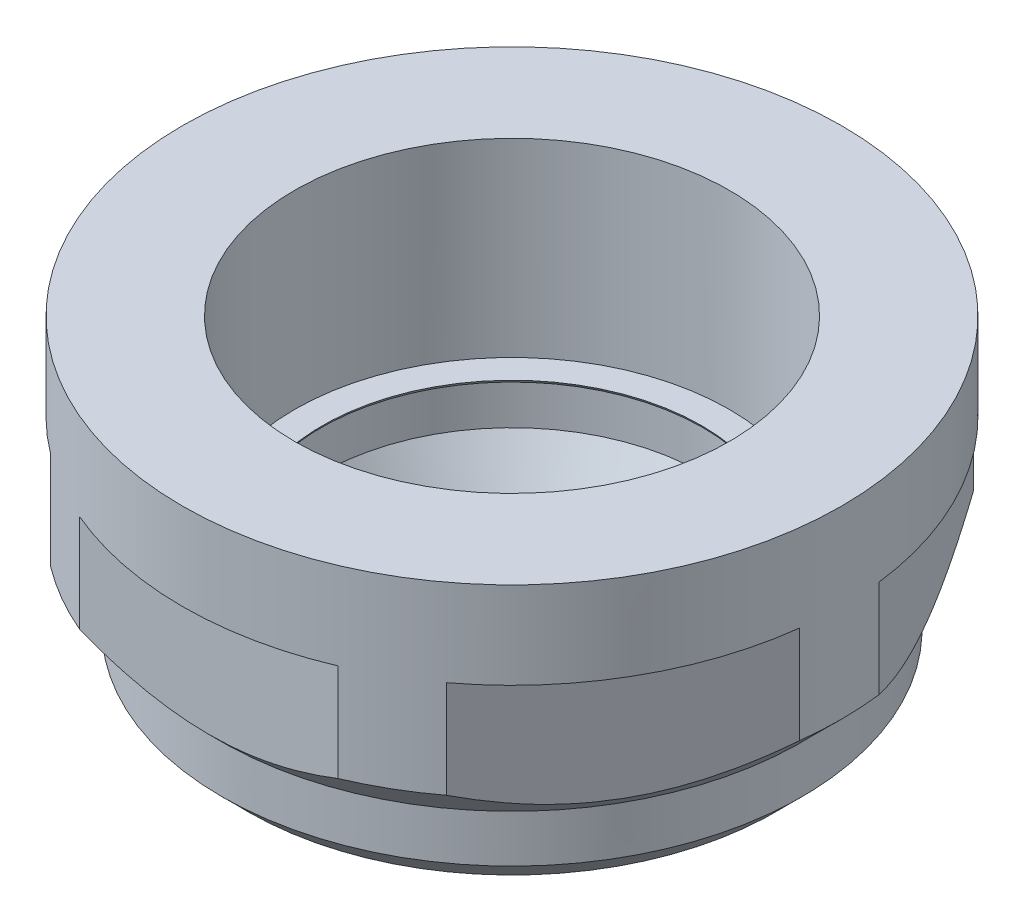
ISO-10303-21;
HEADER;
FILE_DESCRIPTION(('STEP AP214'),'2;1');
FILE_NAME('part.step','',(''),(''),'','','');
FILE_SCHEMA(('AUTOMOTIVE_DESIGN { 1 0 10303 214 1 1 1 1 }'));
ENDSEC;
DATA;
#1=APPLICATION_CONTEXT('core data for automotive mechanical design processes');
#2=APPLICATION_PROTOCOL_DEFINITION('international standard','automotive_design',2000,#1);
#3=PRODUCT_CONTEXT('',#1,'mechanical');
#4=PRODUCT('Part','Part','',(#3));
#5=PRODUCT_RELATED_PRODUCT_CATEGORY('part','',(#4));
#6=PRODUCT_DEFINITION_FORMATION('','',#4);
#7=PRODUCT_DEFINITION_CONTEXT('part definition',#1,'design');
#8=PRODUCT_DEFINITION('design','',#6,#7);
#9=PRODUCT_DEFINITION_SHAPE('','',#8);
#10=(LENGTH_UNIT() NAMED_UNIT(*) SI_UNIT(.MILLI.,.METRE.));
#11=(NAMED_UNIT(*) PLANE_ANGLE_UNIT() SI_UNIT($,.RADIAN.));
#12=(NAMED_UNIT(*) SI_UNIT($,.STERADIAN.) SOLID_ANGLE_UNIT());
#13=UNCERTAINTY_MEASURE_WITH_UNIT(LENGTH_MEASURE(1.E-05),#10,'distance_accuracy_value','');
#14=(GEOMETRIC_REPRESENTATION_CONTEXT(3) GLOBAL_UNCERTAINTY_ASSIGNED_CONTEXT((#13)) GLOBAL_UNIT_ASSIGNED_CONTEXT((#10,
#11,#12)) REPRESENTATION_CONTEXT('',''));
#15=CARTESIAN_POINT('',(0.,0.,0.));
#16=DIRECTION('',(0.,0.,1.));
#17=DIRECTION('',(1.,0.,0.));
#18=AXIS2_PLACEMENT_3D('',#15,#16,#17);
#19=CARTESIAN_POINT('',(0.,0.,0.));
#20=DIRECTION('',(0.,-1.,0.));
#21=DIRECTION('',(0.,0.,-1.));
#22=AXIS2_PLACEMENT_3D('',#19,#20,#21);
#23=CYLINDRICAL_SURFACE('',#22,12.5);
#24=CARTESIAN_POINT('',(0.,11.3,0.));
#25=DIRECTION('',(0.,-1.,0.));
#26=DIRECTION('',(0.,0.,-1.));
#27=AXIS2_PLACEMENT_3D('',#24,#25,#26);
#28=CIRCLE('',#27,12.5);
#29=CARTESIAN_POINT('',(0.,11.3,-12.5));
#30=VERTEX_POINT('',#29);
#31=EDGE_CURVE('E244',#30,#30,#28,.T.);
#32=ORIENTED_EDGE('',*,*,#31,.T.);
#33=EDGE_LOOP('',(#32));
#34=FACE_BOUND('',#33,.T.);
#35=CARTESIAN_POINT('',(0.,8.,0.));
#36=DIRECTION('',(0.,-1.,0.));
#37=DIRECTION('',(0.,0.,-1.));
#38=AXIS2_PLACEMENT_3D('',#35,#36,#37);
#39=CIRCLE('',#38,12.5);
#40=CARTESIAN_POINT('',(-7.50980240073789,8.,9.99264068711927));
#41=VERTEX_POINT('',#40);
#42=CARTESIAN_POINT('',(-12.4087818863042,8.,1.50735931288068));
#43=VERTEX_POINT('',#42);
#44=EDGE_CURVE('E11',#41,#43,#39,.T.);
#45=ORIENTED_EDGE('',*,*,#44,.F.);
#46=DIRECTION('',(0.,-1.,0.));
#47=VECTOR('',#46,1.);
#48=CARTESIAN_POINT('',(-7.50980240073789,0.,9.99264068711927));
#49=LINE('',#48,#47);
#50=CARTESIAN_POINT('',(-7.50980240073789,4.3,9.99264068711927));
#51=VERTEX_POINT('',#50);
#52=EDGE_CURVE('E189',#41,#51,#49,.T.);
#53=ORIENTED_EDGE('',*,*,#52,.T.);
#54=CARTESIAN_POINT('',(0.,4.3,0.));
#55=DIRECTION('',(0.,-1.,0.));
#56=DIRECTION('',(0.,0.,-1.));
#57=AXIS2_PLACEMENT_3D('',#54,#55,#56);
#58=CIRCLE('',#57,12.5);
#59=CARTESIAN_POINT('',(-4.89897948556636,4.3,11.5));
#60=VERTEX_POINT('',#59);
#61=EDGE_CURVE('E240',#60,#51,#58,.T.);
#62=ORIENTED_EDGE('',*,*,#61,.F.);
#63=DIRECTION('',(0.,-1.,0.));
#64=VECTOR('',#63,1.);
#65=CARTESIAN_POINT('',(-4.89897948556636,0.,11.5));
#66=LINE('',#65,#64);
#67=CARTESIAN_POINT('',(-4.89897948556636,8.,11.5));
#68=VERTEX_POINT('',#67);
#69=EDGE_CURVE('E197',#60,#68,#66,.F.);
#70=ORIENTED_EDGE('',*,*,#69,.T.);
#71=CARTESIAN_POINT('',(0.,8.,0.));
#72=DIRECTION('',(0.,-1.,0.));
#73=DIRECTION('',(0.,0.,-1.));
#74=AXIS2_PLACEMENT_3D('',#71,#72,#73);
#75=CIRCLE('',#74,12.5);
#76=CARTESIAN_POINT('',(4.89897948556636,8.,11.5));
#77=VERTEX_POINT('',#76);
#78=EDGE_CURVE('E259',#77,#68,#75,.T.);
#79=ORIENTED_EDGE('',*,*,#78,.F.);
#80=DIRECTION('',(0.,-1.,0.));
#81=VECTOR('',#80,1.);
#82=CARTESIAN_POINT('',(4.89897948556636,0.,11.5));
#83=LINE('',#82,#81);
#84=CARTESIAN_POINT('',(4.89897948556664,4.29999999999991,11.5));
#85=VERTEX_POINT('',#84);
#86=EDGE_CURVE('E201',#77,#85,#83,.T.);
#87=ORIENTED_EDGE('',*,*,#86,.T.);
#88=CARTESIAN_POINT('',(7.50980240073775,4.3,9.99264068711937));
#89=VERTEX_POINT('',#88);
#90=EDGE_CURVE('E150',#89,#85,#58,.T.);
#91=ORIENTED_EDGE('',*,*,#90,.F.);
#92=DIRECTION('',(0.,-1.,0.));
#93=VECTOR('',#92,1.);
#94=CARTESIAN_POINT('',(7.50980240073775,0.,9.99264068711937));
#95=LINE('',#94,#93);
#96=CARTESIAN_POINT('',(7.50980240073775,8.,9.99264068711937));
#97=VERTEX_POINT('',#96);
#98=EDGE_CURVE('E61',#89,#97,#95,.F.);
#99=ORIENTED_EDGE('',*,*,#98,.T.);
#100=CARTESIAN_POINT('',(12.4087818863042,8.,1.50735931288086));
#101=VERTEX_POINT('',#100);
#102=EDGE_CURVE('E48',#101,#97,#39,.T.);
#103=ORIENTED_EDGE('',*,*,#102,.F.);
#104=DIRECTION('',(0.,-1.,0.));
#105=VECTOR('',#104,1.);
#106=CARTESIAN_POINT('',(12.4087818863042,0.,1.50735931288086));
#107=LINE('',#106,#105);
#108=CARTESIAN_POINT('',(12.4087818863042,4.3,1.50735931288086));
#109=VERTEX_POINT('',#108);
#110=EDGE_CURVE('E144',#101,#109,#107,.T.);
#111=ORIENTED_EDGE('',*,*,#110,.T.);
#112=CARTESIAN_POINT('',(12.4087818863042,4.3,-1.5073593128806));
#113=VERTEX_POINT('',#112);
#114=EDGE_CURVE('E575',#113,#109,#58,.T.);
#115=ORIENTED_EDGE('',*,*,#114,.F.);
#116=DIRECTION('',(0.,-1.,0.));
#117=VECTOR('',#116,1.);
#118=CARTESIAN_POINT('',(12.4087818863042,0.,-1.5073593128806));
#119=LINE('',#118,#117);
#120=CARTESIAN_POINT('',(12.4087818863042,8.,-1.5073593128806));
#121=VERTEX_POINT('',#120);
#122=EDGE_CURVE('E69',#113,#121,#119,.F.);
#123=ORIENTED_EDGE('',*,*,#122,.T.);
#124=CARTESIAN_POINT('',(7.50980240073796,8.,-9.99264068711922));
#125=VERTEX_POINT('',#124);
#126=EDGE_CURVE('E141',#125,#121,#39,.T.);
#127=ORIENTED_EDGE('',*,*,#126,.F.);
#128=DIRECTION('',(0.,-1.,0.));
#129=VECTOR('',#128,1.);
#130=CARTESIAN_POINT('',(7.50980240073796,0.,-9.99264068711922));
#131=LINE('',#130,#129);
#132=CARTESIAN_POINT('',(7.50980240073796,4.3,-9.99264068711922));
#133=VERTEX_POINT('',#132);
#134=EDGE_CURVE('E165',#125,#133,#131,.T.);
#135=ORIENTED_EDGE('',*,*,#134,.T.);
#136=CARTESIAN_POINT('',(4.89897948556636,4.3,-11.5));
#137=VERTEX_POINT('',#136);
#138=EDGE_CURVE('E571',#137,#133,#58,.T.);
#139=ORIENTED_EDGE('',*,*,#138,.F.);
#140=DIRECTION('',(0.,-1.,0.));
#141=VECTOR('',#140,1.);
#142=CARTESIAN_POINT('',(4.89897948556636,0.,-11.5));
#143=LINE('',#142,#141);
#144=CARTESIAN_POINT('',(4.89897948556636,8.,-11.5));
#145=VERTEX_POINT('',#144);
#146=EDGE_CURVE('E169',#137,#145,#143,.F.);
#147=ORIENTED_EDGE('',*,*,#146,.T.);
#148=CARTESIAN_POINT('',(-4.89897948556636,8.,-11.5));
#149=VERTEX_POINT('',#148);
#150=EDGE_CURVE('E561',#149,#145,#39,.T.);
#151=ORIENTED_EDGE('',*,*,#150,.F.);
#152=DIRECTION('',(0.,-1.,0.));
#153=VECTOR('',#152,1.);
#154=CARTESIAN_POINT('',(-4.89897948556636,0.,-11.5));
#155=LINE('',#154,#153);
#156=CARTESIAN_POINT('',(-4.89897948556636,4.3,-11.5));
#157=VERTEX_POINT('',#156);
#158=EDGE_CURVE('E173',#149,#157,#155,.T.);
#159=ORIENTED_EDGE('',*,*,#158,.T.);
#160=CARTESIAN_POINT('',(-7.50980240073782,4.3,-9.99264068711932));
#161=VERTEX_POINT('',#160);
#162=EDGE_CURVE('E574',#161,#157,#58,.T.);
#163=ORIENTED_EDGE('',*,*,#162,.F.);
#164=DIRECTION('',(0.,-1.,0.));
#165=VECTOR('',#164,1.);
#166=CARTESIAN_POINT('',(-7.50980240073782,0.,-9.99264068711932));
#167=LINE('',#166,#165);
#168=CARTESIAN_POINT('',(-7.50980240073782,8.,-9.99264068711932));
#169=VERTEX_POINT('',#168);
#170=EDGE_CURVE('E177',#161,#169,#167,.F.);
#171=ORIENTED_EDGE('',*,*,#170,.T.);
#172=CARTESIAN_POINT('',(-12.4087818863042,8.,-1.50735931288077));
#173=VERTEX_POINT('',#172);
#174=EDGE_CURVE('E54',#173,#169,#39,.T.);
#175=ORIENTED_EDGE('',*,*,#174,.F.);
#176=DIRECTION('',(0.,-1.,0.));
#177=VECTOR('',#176,1.);
#178=CARTESIAN_POINT('',(-12.4087818863042,0.,-1.50735931288077));
#179=LINE('',#178,#177);
#180=CARTESIAN_POINT('',(-12.4087818863042,4.3,-1.50735931288077));
#181=VERTEX_POINT('',#180);
#182=EDGE_CURVE('E181',#173,#181,#179,.T.);
#183=ORIENTED_EDGE('',*,*,#182,.T.);
#184=CARTESIAN_POINT('',(-12.4087818863042,4.3,1.50735931288069));
#185=VERTEX_POINT('',#184);
#186=EDGE_CURVE('E245',#185,#181,#58,.T.);
#187=ORIENTED_EDGE('',*,*,#186,.F.);
#188=DIRECTION('',(0.,-1.,0.));
#189=VECTOR('',#188,1.);
#190=CARTESIAN_POINT('',(-12.4087818863042,0.,1.50735931288069));
#191=LINE('',#190,#189);
#192=EDGE_CURVE('E185',#185,#43,#191,.F.);
#193=ORIENTED_EDGE('',*,*,#192,.T.);
#194=EDGE_LOOP('',(#45,#53,#62,#70,#79,#87,#91,#99,#103,#111,#115,#123,#127,#135,#139,#147,#151,
#159,#163,#171,#175,#183,#187,#193));
#195=FACE_BOUND('',#194,.T.);
#196=ADVANCED_FACE('F44',(#34,#195),#23,.T.);
#197=CARTESIAN_POINT('',(-10.,0.,0.));
#198=DIRECTION('',(0.,1.,0.));
#199=DIRECTION('',(0.,0.,1.));
#200=AXIS2_PLACEMENT_3D('',#197,#198,#199);
#201=PLANE('',#200);
#202=CARTESIAN_POINT('',(0.,0.,0.));
#203=DIRECTION('',(0.,-1.,0.));
#204=DIRECTION('',(0.,0.,-1.));
#205=AXIS2_PLACEMENT_3D('',#202,#203,#204);
#206=CIRCLE('',#205,10.);
#207=CARTESIAN_POINT('',(0.,0.,-10.));
#208=VERTEX_POINT('',#207);
#209=EDGE_CURVE('E228',#208,#208,#206,.T.);
#210=ORIENTED_EDGE('',*,*,#209,.T.);
#211=EDGE_LOOP('',(#210));
#212=FACE_BOUND('',#211,.T.);
#213=CARTESIAN_POINT('',(0.,0.,0.));
#214=DIRECTION('',(0.,-1.,0.));
#215=DIRECTION('',(0.,0.,-1.));
#216=AXIS2_PLACEMENT_3D('',#213,#214,#215);
#217=CIRCLE('',#216,5.80662432702593);
#218=CARTESIAN_POINT('',(0.,0.,-5.80662432702593));
#219=VERTEX_POINT('',#218);
#220=EDGE_CURVE('E224',#219,#219,#217,.T.);
#221=ORIENTED_EDGE('',*,*,#220,.F.);
#222=EDGE_LOOP('',(#221));
#223=FACE_BOUND('',#222,.T.);
#224=ADVANCED_FACE('F341',(#212,#223),#201,.F.);
#225=CARTESIAN_POINT('',(-12.5,11.3,0.));
#226=DIRECTION('',(0.,-1.,0.));
#227=DIRECTION('',(0.,0.,-1.));
#228=AXIS2_PLACEMENT_3D('',#225,#226,#227);
#229=PLANE('',#228);
#230=CARTESIAN_POINT('',(0.,11.3,0.));
#231=DIRECTION('',(0.,1.,0.));
#232=DIRECTION('',(0.,0.,1.));
#233=AXIS2_PLACEMENT_3D('',#230,#231,#232);
#234=CIRCLE('',#233,8.25);
#235=CARTESIAN_POINT('',(0.,11.3,8.25));
#236=VERTEX_POINT('',#235);
#237=EDGE_CURVE('E204',#236,#236,#234,.T.);
#238=ORIENTED_EDGE('',*,*,#237,.F.);
#239=EDGE_LOOP('',(#238));
#240=FACE_BOUND('',#239,.T.);
#241=ORIENTED_EDGE('',*,*,#31,.F.);
#242=EDGE_LOOP('',(#241));
#243=FACE_BOUND('',#242,.T.);
#244=ADVANCED_FACE('F46',(#240,#243),#229,.F.);
#245=CARTESIAN_POINT('',(0.,4.3,0.));
#246=DIRECTION('',(0.,1.,0.));
#247=DIRECTION('',(0.,0.,1.));
#248=AXIS2_PLACEMENT_3D('',#245,#246,#247);
#249=CONICAL_SURFACE('',#248,12.5,0.785398163397447);
#250=CARTESIAN_POINT('',(0.,2.79999999999999,0.));
#251=DIRECTION('',(0.,-1.,0.));
#252=DIRECTION('',(0.,0.,-1.));
#253=AXIS2_PLACEMENT_3D('',#250,#251,#252);
#254=CIRCLE('',#253,11.);
#255=CARTESIAN_POINT('',(0.,2.79999999999999,-11.));
#256=VERTEX_POINT('',#255);
#257=EDGE_CURVE('E236',#256,#256,#254,.T.);
#258=ORIENTED_EDGE('',*,*,#257,.F.);
#259=EDGE_LOOP('',(#258));
#260=FACE_BOUND('',#259,.T.);
#261=ORIENTED_EDGE('',*,*,#61,.T.);
#262=CARTESIAN_POINT('',(-7.50954725680327,4.3002,9.99308260937728));
#263=CARTESIAN_POINT('',(-7.60320388466721,4.22678602630348,9.83086457145136));
#264=CARTESIAN_POINT('',(-7.69746398783073,4.15645504779764,9.66760128364545));
#265=CARTESIAN_POINT('',(-7.88722179118836,4.02261542047035,9.33893112709737));
#266=CARTESIAN_POINT('',(-7.98271990557269,3.95910912457528,9.17352354095669));
#267=CARTESIAN_POINT('',(-8.27145088309206,3.77961750230972,8.67342681817411));
#268=CARTESIAN_POINT('',(-8.46650035350401,3.67499486488197,8.33559122543122));
#269=CARTESIAN_POINT('',(-8.85898212114275,3.50246664844852,7.65579286283646));
#270=CARTESIAN_POINT('',(-9.05638036657891,3.43425834287242,7.31388907241607));
#271=CARTESIAN_POINT('',(-9.35415117795865,3.36182614192228,6.79813489809537));
#272=CARTESIAN_POINT('',(-9.45365130618154,3.3426636284266,6.62579562065369));
#273=CARTESIAN_POINT('',(-9.65300814090227,3.31458876137679,6.28049945408129));
#274=CARTESIAN_POINT('',(-9.75286479701911,3.30567501292755,6.10754265221297));
#275=CARTESIAN_POINT('',(-9.94878007774333,3.29841574605801,5.7682074320195));
#276=CARTESIAN_POINT('',(-10.0448351190914,3.29967205911473,5.60183522008153));
#277=CARTESIAN_POINT('',(-10.2367882842751,3.31178573042226,5.26936258530977));
#278=CARTESIAN_POINT('',(-10.3326864162155,3.32264257601293,5.10326214843791));
#279=CARTESIAN_POINT('',(-10.5241386103169,3.35377791625605,4.77165722103387));
#280=CARTESIAN_POINT('',(-10.6196925143207,3.37406029350188,4.60615300443768));
#281=CARTESIAN_POINT('',(-10.8102130868605,3.42370616038155,4.27616169291167));
#282=CARTESIAN_POINT('',(-10.9051796794171,3.45307080090065,4.11167472958195));
#283=CARTESIAN_POINT('',(-11.1886609726452,3.55403745888742,3.62067072671556));
#284=CARTESIAN_POINT('',(-11.3760495375729,3.63856211352554,3.29610421150338));
#285=CARTESIAN_POINT('',(-11.7467600464601,3.83753972384318,2.65401477521092));
#286=CARTESIAN_POINT('',(-11.9300815222568,3.951996105773,2.33649266501248));
#287=CARTESIAN_POINT('',(-12.1611756655044,4.11399139107226,1.93622586757615));
#288=CARTESIAN_POINT('',(-12.2110268906147,4.15000907902424,1.84988101286555));
#289=CARTESIAN_POINT('',(-12.3103188049221,4.22380068400442,1.67790237250439));
#290=CARTESIAN_POINT('',(-12.3597599957871,4.26157189970384,1.59226771793941));
#291=CARTESIAN_POINT('',(-12.4090370302388,4.3002,1.50691739062268));
#292=B_SPLINE_CURVE_WITH_KNOTS('',3,(#262,#263,#264,#265,#266,#267,#268,#269,#270,#271,#272,
#273,#274,#275,#276,#277,#278,#279,#280,#281,#282,#283,#284,#285,#286,#287,#288,#289,#290,#291),
.UNSPECIFIED.,.F.,.F.,(4,2,2,2,2,2,2,2,2,2,2,2,2,2,4),(0.,0.603515867391192,1.20723914416742,
2.41739229578831,3.61732180894164,4.21685988655414,4.81631635513753,5.39242041024152,
5.96849370374486,6.54480450572042,7.12118836652659,8.27220258349449,9.42334861344793,
9.74136578117776,10.0589083210021),.UNSPECIFIED.);
#293=EDGE_CURVE('E142',#51,#185,#292,.T.);
#294=ORIENTED_EDGE('',*,*,#293,.T.);
#295=ORIENTED_EDGE('',*,*,#186,.T.);
#296=CARTESIAN_POINT('',(-12.4090370302388,4.3002,-1.50691739062277));
#297=CARTESIAN_POINT('',(-12.3153804023749,4.22678602630348,-1.66913542854868));
#298=CARTESIAN_POINT('',(-12.2211202992114,4.15645504779764,-1.83239871635459));
#299=CARTESIAN_POINT('',(-12.0313624958537,4.02261542047035,-2.16106887290267));
#300=CARTESIAN_POINT('',(-11.9358643814694,3.95910912457528,-2.32647645904334));
#301=CARTESIAN_POINT('',(-11.64713340395,3.77961750230972,-2.82657318182592));
#302=CARTESIAN_POINT('',(-11.4520839335381,3.67499486488197,-3.16440877456882));
#303=CARTESIAN_POINT('',(-11.0596021658993,3.50246664844853,-3.84420713716357));
#304=CARTESIAN_POINT('',(-10.8622039204632,3.43425834287242,-4.18611092758395));
#305=CARTESIAN_POINT('',(-10.5644331090834,3.36182614192228,-4.70186510190466));
#306=CARTESIAN_POINT('',(-10.4649329808605,3.3426636284266,-4.87420437934633));
#307=CARTESIAN_POINT('',(-10.2655761461398,3.31458876137679,-5.21950054591874));
#308=CARTESIAN_POINT('',(-10.165719490023,3.30567501292755,-5.39245734778705));
#309=CARTESIAN_POINT('',(-9.96980420929874,3.29841574605801,-5.73179256798052));
#310=CARTESIAN_POINT('',(-9.87374916795068,3.29967205911473,-5.89816477991849));
#311=CARTESIAN_POINT('',(-9.68179600276703,3.31178573042226,-6.23063741469024));
#312=CARTESIAN_POINT('',(-9.58589787082654,3.32264257601293,-6.39673785156211));
#313=CARTESIAN_POINT('',(-9.39444567672521,3.35377791625605,-6.72834277896614));
#314=CARTESIAN_POINT('',(-9.29889177272138,3.37406029350188,-6.89384699556233));
#315=CARTESIAN_POINT('',(-9.1083712001816,3.42370616038155,-7.22383830708835));
#316=CARTESIAN_POINT('',(-9.013404607625,3.45307080090065,-7.38832527041806));
#317=CARTESIAN_POINT('',(-8.7299233143969,3.55403745888742,-7.87932927328445));
#318=CARTESIAN_POINT('',(-8.54253474946921,3.63856211352554,-8.20389578849663));
#319=CARTESIAN_POINT('',(-8.17182424058194,3.83753972384318,-8.84598522478909));
#320=CARTESIAN_POINT('',(-7.98850276478521,3.951996105773,-9.16350733498753));
#321=CARTESIAN_POINT('',(-7.75740862153768,4.11399139107226,-9.56377413242385));
#322=CARTESIAN_POINT('',(-7.70755739642737,4.15000907902424,-9.65011898713445));
#323=CARTESIAN_POINT('',(-7.60826548211999,4.22380068400442,-9.82209762749561));
#324=CARTESIAN_POINT('',(-7.55882429125494,4.26157189970384,-9.90773228206059));
#325=CARTESIAN_POINT('',(-7.5095472568032,4.3002,-9.99308260937732));
#326=B_SPLINE_CURVE_WITH_KNOTS('',3,(#296,#297,#298,#299,#300,#301,#302,#303,#304,#305,#306,
#307,#308,#309,#310,#311,#312,#313,#314,#315,#316,#317,#318,#319,#320,#321,#322,#323,#324,#325),
.UNSPECIFIED.,.F.,.F.,(4,2,2,2,2,2,2,2,2,2,2,2,2,2,4),(0.,0.603515867391193,1.20723914416742,
2.4173922957883,3.61732180894164,4.21685988655414,4.81631635513753,5.39242041024151,
5.96849370374485,6.54480450572042,7.12118836652658,8.27220258349449,9.42334861344792,
9.74136578117775,10.0589083210021),.UNSPECIFIED.);
#327=EDGE_CURVE('E298',#181,#161,#326,.T.);
#328=ORIENTED_EDGE('',*,*,#327,.T.);
#329=ORIENTED_EDGE('',*,*,#162,.T.);
#330=CARTESIAN_POINT('',(-13.345164717821,9.41656667304314,-11.5));
#331=CARTESIAN_POINT('',(-13.0206857914466,9.17081833500919,-11.5));
#332=CARTESIAN_POINT('',(-12.6944017140547,8.92741491072988,-11.5));
#333=CARTESIAN_POINT('',(-12.0375067482082,8.4463514742273,-11.5));
#334=CARTESIAN_POINT('',(-11.7068948046201,8.20869290437065,-11.5));
#335=CARTESIAN_POINT('',(-11.0382089221408,7.73848227127449,-11.5));
#336=CARTESIAN_POINT('',(-10.7000970231063,7.50598400921161,-11.5));
#337=CARTESIAN_POINT('',(-10.0181522543491,7.0495623938496,-11.5));
#338=CARTESIAN_POINT('',(-9.67431978935343,6.8256384375923,-11.5));
#339=CARTESIAN_POINT('',(-8.95980972067628,6.37555294922629,-11.5));
#340=CARTESIAN_POINT('',(-8.588734361363,6.15001965333814,-11.5));
#341=CARTESIAN_POINT('',(-7.83791120612329,5.71364402612219,-11.5));
#342=CARTESIAN_POINT('',(-7.45816203446283,5.50280404705562,-11.5));
#343=CARTESIAN_POINT('',(-6.69000285141517,5.10035444791485,-11.5));
#344=CARTESIAN_POINT('',(-6.30162269711823,4.90868828553966,-11.5));
#345=CARTESIAN_POINT('',(-5.51420250829026,4.5488778259845,-11.5));
#346=CARTESIAN_POINT('',(-5.1151674351297,4.38072280091793,-11.5));
#347=CARTESIAN_POINT('',(-4.33965651465308,4.08678000547791,-11.5));
#348=CARTESIAN_POINT('',(-3.96408756551915,3.95862426986464,-11.5));
#349=CARTESIAN_POINT('',(-3.20381724269432,3.73242924077372,-11.5));
#350=CARTESIAN_POINT('',(-2.81911525044026,3.63439199346715,-11.5));
#351=CARTESIAN_POINT('',(-2.04932448535138,3.47521566298782,-11.5));
#352=CARTESIAN_POINT('',(-1.66436994690094,3.41343804866037,-11.5));
#353=CARTESIAN_POINT('',(-0.89023170183123,3.32799642541784,-11.5));
#354=CARTESIAN_POINT('',(-0.501048758530793,3.3043256488083,-11.5));
#355=CARTESIAN_POINT('',(0.263130632200306,3.29690034116124,-11.5));
#356=CARTESIAN_POINT('',(0.638113355925546,3.3116862436956,-11.5));
#357=CARTESIAN_POINT('',(1.38491696786417,3.37711302506578,-11.5));
#358=CARTESIAN_POINT('',(1.75673754855237,3.42775735175354,-11.5));
#359=CARTESIAN_POINT('',(2.50081399038522,3.5629822642582,-11.5));
#360=CARTESIAN_POINT('',(2.87296252143321,3.64814397257287,-11.5));
#361=CARTESIAN_POINT('',(3.60913770670876,3.84783107137947,-11.5));
#362=CARTESIAN_POINT('',(3.97316500218602,3.96235413452606,-11.5));
#363=CARTESIAN_POINT('',(4.72373254000522,4.22697597858958,-11.5));
#364=CARTESIAN_POINT('',(5.10947948676676,4.37930171670574,-11.5));
#365=CARTESIAN_POINT('',(5.87097293216513,4.70736803911418,-11.5));
#366=CARTESIAN_POINT('',(6.24671470257629,4.88311946626187,-11.5));
#367=CARTESIAN_POINT('',(6.99002219401752,5.25385855660608,-11.5));
#368=CARTESIAN_POINT('',(7.35755764889467,5.44890641241889,-11.5));
#369=CARTESIAN_POINT('',(8.08417765456329,5.85393079193678,-11.5));
#370=CARTESIAN_POINT('',(8.443263529418,6.06390495564813,-11.5));
#371=CARTESIAN_POINT('',(9.13644642307364,6.4851192401991,-11.5));
#372=CARTESIAN_POINT('',(9.47089854514101,6.69577806002316,-11.5));
#373=CARTESIAN_POINT('',(10.1340600766163,7.12597573671376,-11.5));
#374=CARTESIAN_POINT('',(10.4627690491169,7.34551526500016,-11.5));
#375=CARTESIAN_POINT('',(11.1125344863582,7.79007923784461,-11.5));
#376=CARTESIAN_POINT('',(11.4336313827967,8.01504480011891,-11.5));
#377=CARTESIAN_POINT('',(12.0714336041769,8.47094126788601,-11.5));
#378=CARTESIAN_POINT('',(12.3881401131769,8.70187051494423,-11.5));
#379=CARTESIAN_POINT('',(12.7030075196343,8.93523854645405,-11.5));
#380=B_SPLINE_CURVE_WITH_KNOTS('',3,(#330,#331,#332,#333,#334,#335,#336,#337,#338,#339,#340,
#341,#342,#343,#344,#345,#346,#347,#348,#349,#350,#351,#352,#353,#354,#355,#356,#357,#358,#359,
#360,#361,#362,#363,#364,#365,#366,#367,#368,#369,#370,#371,#372,#373,#374,#375,#376,#377,#378,
#379),.UNSPECIFIED.,.F.,.F.,(4,2,2,2,2,2,2,2,2,2,2,2,2,2,2,2,2,2,2,2,2,2,2,2,4),(0.,
1.22113374842284,2.44257096899193,3.6734675714011,4.90427745573231,6.20671938815133,
7.50936935249995,8.80805704669759,10.1061502157847,11.2956050367545,12.4851406483036,
13.6530460396322,14.8207439905218,15.9447758977162,17.0689158972783,18.2128243965211,
19.3566422511916,20.5998769171324,21.8436890402128,23.0915113360517,24.3391367760541,
25.524770570584,26.7104941722968,27.8866067944889,29.0623958017999),.UNSPECIFIED.);
#381=EDGE_CURVE('E291',#157,#137,#380,.T.);
#382=ORIENTED_EDGE('',*,*,#381,.T.);
#383=ORIENTED_EDGE('',*,*,#138,.T.);
#384=CARTESIAN_POINT('',(7.50954725680334,4.3002,-9.99308260937722));
#385=CARTESIAN_POINT('',(7.60320388466728,4.22678602630348,-9.8308645714513));
#386=CARTESIAN_POINT('',(7.6974639878308,4.15645504779763,-9.66760128364539));
#387=CARTESIAN_POINT('',(7.88722179118843,4.02261542047035,-9.33893112709731));
#388=CARTESIAN_POINT('',(7.98271990557275,3.95910912457527,-9.17352354095664));
#389=CARTESIAN_POINT('',(8.27145088309212,3.77961750230972,-8.67342681817405));
#390=CARTESIAN_POINT('',(8.46650035350407,3.67499486488197,-8.33559122543116));
#391=CARTESIAN_POINT('',(8.85898212114281,3.50246664844852,-7.6557928628364));
#392=CARTESIAN_POINT('',(9.05638036657896,3.43425834287242,-7.31388907241601));
#393=CARTESIAN_POINT('',(9.35415117795869,3.36182614192227,-6.7981348980953));
#394=CARTESIAN_POINT('',(9.45365130618159,3.3426636284266,-6.62579562065362));
#395=CARTESIAN_POINT('',(9.65300814090231,3.31458876137679,-6.28049945408122));
#396=CARTESIAN_POINT('',(9.75286479701916,3.30567501292755,-6.1075426522129));
#397=CARTESIAN_POINT('',(9.94878007774338,3.29841574605801,-5.76820743201943));
#398=CARTESIAN_POINT('',(10.0448351190914,3.29967205911473,-5.60183522008146));
#399=CARTESIAN_POINT('',(10.2367882842751,3.31178573042226,-5.26936258530971));
#400=CARTESIAN_POINT('',(10.3326864162156,3.32264257601293,-5.10326214843784));
#401=CARTESIAN_POINT('',(10.5241386103169,3.35377791625605,-4.7716572210338));
#402=CARTESIAN_POINT('',(10.6196925143207,3.37406029350188,-4.60615300443761));
#403=CARTESIAN_POINT('',(10.8102130868605,3.42370616038155,-4.27616169291159));
#404=CARTESIAN_POINT('',(10.9051796794171,3.45307080090065,-4.11167472958188));
#405=CARTESIAN_POINT('',(11.1886609726452,3.55403745888742,-3.62067072671548));
#406=CARTESIAN_POINT('',(11.3760495375729,3.63856211352553,-3.2961042115033));
#407=CARTESIAN_POINT('',(11.7467600464601,3.83753972384317,-2.65401477521084));
#408=CARTESIAN_POINT('',(11.9300815222569,3.951996105773,-2.3364926650124));
#409=CARTESIAN_POINT('',(12.1611756655044,4.11399139107226,-1.93622586757607));
#410=CARTESIAN_POINT('',(12.2110268906147,4.15000907902424,-1.84988101286547));
#411=CARTESIAN_POINT('',(12.3103188049221,4.22380068400442,-1.67790237250431));
#412=CARTESIAN_POINT('',(12.3597599957871,4.26157189970384,-1.59226771793933));
#413=CARTESIAN_POINT('',(12.4090370302389,4.3002,-1.50691739062259));
#414=B_SPLINE_CURVE_WITH_KNOTS('',3,(#384,#385,#386,#387,#388,#389,#390,#391,#392,#393,#394,
#395,#396,#397,#398,#399,#400,#401,#402,#403,#404,#405,#406,#407,#408,#409,#410,#411,#412,#413),
.UNSPECIFIED.,.F.,.F.,(4,2,2,2,2,2,2,2,2,2,2,2,2,2,4),(0.,0.603515867391192,1.20723914416742,
2.41739229578831,3.61732180894164,4.21685988655414,4.81631635513753,5.39242041024151,
5.96849370374485,6.54480450572042,7.12118836652658,8.27220258349448,9.42334861344792,
9.74136578117775,10.0589083210021),.UNSPECIFIED.);
#415=EDGE_CURVE('E284',#133,#113,#414,.T.);
#416=ORIENTED_EDGE('',*,*,#415,.T.);
#417=ORIENTED_EDGE('',*,*,#114,.T.);
#418=CARTESIAN_POINT('',(12.4090370302388,4.3002,1.50691739062285));
#419=CARTESIAN_POINT('',(12.3153804023749,4.22678602630348,1.66913542854877));
#420=CARTESIAN_POINT('',(12.2211202992114,4.15645504779763,1.83239871635468));
#421=CARTESIAN_POINT('',(12.0313624958537,4.02261542047035,2.16106887290275));
#422=CARTESIAN_POINT('',(11.9358643814694,3.95910912457528,2.32647645904343));
#423=CARTESIAN_POINT('',(11.64713340395,3.77961750230972,2.82657318182601));
#424=CARTESIAN_POINT('',(11.4520839335381,3.67499486488197,3.1644087745689));
#425=CARTESIAN_POINT('',(11.0596021658993,3.50246664844852,3.84420713716365));
#426=CARTESIAN_POINT('',(10.8622039204631,3.43425834287242,4.18611092758403));
#427=CARTESIAN_POINT('',(10.5644331090834,3.36182614192228,4.70186510190474));
#428=CARTESIAN_POINT('',(10.4649329808605,3.3426636284266,4.87420437934641));
#429=CARTESIAN_POINT('',(10.2655761461398,3.31458876137679,5.21950054591881));
#430=CARTESIAN_POINT('',(10.1657194900229,3.30567501292755,5.39245734778713));
#431=CARTESIAN_POINT('',(9.9698042092987,3.29841574605801,5.73179256798059));
#432=CARTESIAN_POINT('',(9.87374916795064,3.29967205911473,5.89816477991856));
#433=CARTESIAN_POINT('',(9.68179600276698,3.31178573042226,6.23063741469031));
#434=CARTESIAN_POINT('',(9.58589787082649,3.32264257601293,6.39673785156218));
#435=CARTESIAN_POINT('',(9.39444567672516,3.35377791625605,6.72834277896621));
#436=CARTESIAN_POINT('',(9.29889177272133,3.37406029350188,6.8938469955624));
#437=CARTESIAN_POINT('',(9.10837120018155,3.42370616038155,7.22383830708841));
#438=CARTESIAN_POINT('',(9.01340460762495,3.45307080090065,7.38832527041813));
#439=CARTESIAN_POINT('',(8.72992331439685,3.55403745888742,7.87932927328452));
#440=CARTESIAN_POINT('',(8.54253474946915,3.63856211352554,8.20389578849669));
#441=CARTESIAN_POINT('',(8.17182424058188,3.83753972384318,8.84598522478915));
#442=CARTESIAN_POINT('',(7.98850276478515,3.951996105773,9.16350733498758));
#443=CARTESIAN_POINT('',(7.75740862153761,4.11399139107226,9.56377413242391));
#444=CARTESIAN_POINT('',(7.70755739642731,4.15000907902424,9.65011898713451));
#445=CARTESIAN_POINT('',(7.60826548211992,4.22380068400442,9.82209762749566));
#446=CARTESIAN_POINT('',(7.55882429125487,4.26157189970384,9.90773228206064));
#447=CARTESIAN_POINT('',(7.50954725680313,4.3002,9.99308260937738));
#448=B_SPLINE_CURVE_WITH_KNOTS('',3,(#418,#419,#420,#421,#422,#423,#424,#425,#426,#427,#428,
#429,#430,#431,#432,#433,#434,#435,#436,#437,#438,#439,#440,#441,#442,#443,#444,#445,#446,#447),
.UNSPECIFIED.,.F.,.F.,(4,2,2,2,2,2,2,2,2,2,2,2,2,2,4),(0.,0.603515867391192,1.20723914416742,
2.41739229578831,3.61732180894164,4.21685988655414,4.81631635513753,5.39242041024151,
5.96849370374485,6.54480450572041,7.12118836652658,8.27220258349448,9.42334861344792,
9.74136578117774,10.0589083210021),.UNSPECIFIED.);
#449=EDGE_CURVE('E276',#109,#89,#448,.T.);
#450=ORIENTED_EDGE('',*,*,#449,.T.);
#451=ORIENTED_EDGE('',*,*,#90,.T.);
#452=CARTESIAN_POINT('',(-13.8612380538536,9.81066129784247,11.5));
#453=CARTESIAN_POINT('',(-13.5263766438228,9.55300548430736,11.5));
#454=CARTESIAN_POINT('',(-13.1897115166881,9.29765703765776,11.5));
#455=CARTESIAN_POINT('',(-12.5120363828083,8.792629199495,11.5));
#456=CARTESIAN_POINT('',(-12.171025367443,8.54295116283867,11.5));
#457=CARTESIAN_POINT('',(-11.4814290609378,8.04854166196527,11.5));
#458=CARTESIAN_POINT('',(-11.1328056329772,7.80386321666104,11.5));
#459=CARTESIAN_POINT('',(-10.4297576584665,7.32301635753564,11.5));
#460=CARTESIAN_POINT('',(-10.0753335137352,7.08684735785839,11.5));
#461=CARTESIAN_POINT('',(-9.33700033412278,6.6103019768615,11.5));
#462=CARTESIAN_POINT('',(-8.95264752515094,6.37060970512933,11.5));
#463=CARTESIAN_POINT('',(-8.17491564158931,5.90609547542514,11.5));
#464=CARTESIAN_POINT('',(-7.78153506217769,5.68127602118271,11.5));
#465=CARTESIAN_POINT('',(-6.98563885090295,5.2512947407858,11.5));
#466=CARTESIAN_POINT('',(-6.58315463899398,5.04607521103257,11.5));
#467=CARTESIAN_POINT('',(-5.76680521132552,4.65989169749234,11.5));
#468=CARTESIAN_POINT('',(-5.35294547817307,4.47891626762926,11.5));
#469=CARTESIAN_POINT('',(-4.55444586645618,4.16414514676762,11.5));
#470=CARTESIAN_POINT('',(-4.17095882830476,4.02745470116268,11.5));
#471=CARTESIAN_POINT('',(-3.39421030837687,3.78476915281813,11.5));
#472=CARTESIAN_POINT('',(-3.00094820612853,3.67877600401875,11.5));
#473=CARTESIAN_POINT('',(-2.21385012974057,3.50499086598435,11.5));
#474=CARTESIAN_POINT('',(-1.82017004040771,3.43650471794028,11.5));
#475=CARTESIAN_POINT('',(-1.02791316076795,3.33916307885739,11.5));
#476=CARTESIAN_POINT('',(-0.629337405300943,3.31029935313062,11.5));
#477=CARTESIAN_POINT('',(0.151186202461904,3.29466378010845,11.5));
#478=CARTESIAN_POINT('',(0.533098600788022,3.30610560410842,11.5));
#479=CARTESIAN_POINT('',(1.29394541094463,3.36634744718735,11.5));
#480=CARTESIAN_POINT('',(1.67287954929391,3.41515085745393,11.5));
#481=CARTESIAN_POINT('',(2.4314495777494,3.54818510777867,11.5));
#482=CARTESIAN_POINT('',(2.81097386524631,3.63304161386399,11.5));
#483=CARTESIAN_POINT('',(3.56166382931449,3.83347281774734,11.5));
#484=CARTESIAN_POINT('',(3.93282997741709,3.94904577791799,11.5));
#485=CARTESIAN_POINT('',(4.68715186915965,4.21319530053486,11.5));
#486=CARTESIAN_POINT('',(5.06977107722233,4.36328666602302,11.5));
#487=CARTESIAN_POINT('',(5.82516844935641,4.68665846578115,11.5));
#488=CARTESIAN_POINT('',(6.19794208592648,4.85994935351362,11.5));
#489=CARTESIAN_POINT('',(6.93540833780696,5.22561071799191,11.5));
#490=CARTESIAN_POINT('',(7.30007158111164,5.41803995149576,11.5));
#491=CARTESIAN_POINT('',(8.0210422215054,5.81774352106904,11.5));
#492=CARTESIAN_POINT('',(8.37735089368,6.02501557197301,11.5));
#493=CARTESIAN_POINT('',(9.06529074963301,6.44097742831745,11.5));
#494=CARTESIAN_POINT('',(9.39727169767738,6.6490918315058,11.5));
#495=CARTESIAN_POINT('',(10.0555298881723,7.07417972934027,11.5));
#496=CARTESIAN_POINT('',(10.3818067003983,7.29115388813634,11.5));
#497=CARTESIAN_POINT('',(11.0267798174898,7.73061523377701,11.5));
#498=CARTESIAN_POINT('',(11.345515951002,7.95304417647772,11.5));
#499=CARTESIAN_POINT('',(11.9786154858278,8.40386512389498,11.5));
#500=CARTESIAN_POINT('',(12.2929800683417,8.63225546788372,11.5));
#501=CARTESIAN_POINT('',(12.6055108338085,8.86308598645815,11.5));
#502=B_SPLINE_CURVE_WITH_KNOTS('',3,(#452,#453,#454,#455,#456,#457,#458,#459,#460,#461,#462,
#463,#464,#465,#466,#467,#468,#469,#470,#471,#472,#473,#474,#475,#476,#477,#478,#479,#480,#481,
#482,#483,#484,#485,#486,#487,#488,#489,#490,#491,#492,#493,#494,#495,#496,#497,#498,#499,#500,
#501),.UNSPECIFIED.,.F.,.F.,(4,2,2,2,2,2,2,2,2,2,2,2,2,2,2,2,2,2,2,2,2,2,2,2,4),(0.,
1.26756737715701,2.53543449964321,3.81308249130956,5.09064235106549,6.44927699932693,
7.80813978477955,9.16286998541451,10.5169583223468,11.7372654343888,12.957650204194,
14.1546118151129,15.3513246250299,16.4956795558013,17.6401383682025,18.8053260984108,
19.9704479280655,21.2025175224124,22.4351441547866,23.6716792997074,24.9080244781745,
26.0833198017414,27.2587033907794,28.4246507607574,29.5902767164645),.UNSPECIFIED.);
#503=EDGE_CURVE('E249',#85,#60,#502,.F.);
#504=ORIENTED_EDGE('',*,*,#503,.T.);
#505=EDGE_LOOP('',(#261,#294,#295,#328,#329,#382,#383,#416,#417,#450,#451,#504));
#506=FACE_BOUND('',#505,.T.);
#507=ADVANCED_FACE('F265',(#260,#506),#249,.T.);
#508=CARTESIAN_POINT('',(0.,0.,0.));
#509=DIRECTION('',(0.,-1.,0.));
#510=DIRECTION('',(0.,0.,-1.));
#511=AXIS2_PLACEMENT_3D('',#508,#509,#510);
#512=CYLINDRICAL_SURFACE('',#511,11.);
#513=CARTESIAN_POINT('',(0.,1.,0.));
#514=DIRECTION('',(0.,-1.,0.));
#515=DIRECTION('',(0.,0.,-1.));
#516=AXIS2_PLACEMENT_3D('',#513,#514,#515);
#517=CIRCLE('',#516,11.);
#518=CARTESIAN_POINT('',(0.,1.,-11.));
#519=VERTEX_POINT('',#518);
#520=EDGE_CURVE('E232',#519,#519,#517,.T.);
#521=ORIENTED_EDGE('',*,*,#520,.F.);
#522=EDGE_LOOP('',(#521));
#523=FACE_BOUND('',#522,.T.);
#524=ORIENTED_EDGE('',*,*,#257,.T.);
#525=EDGE_LOOP('',(#524));
#526=FACE_BOUND('',#525,.T.);
#527=ADVANCED_FACE('F269',(#523,#526),#512,.T.);
#528=CARTESIAN_POINT('',(0.,1.,0.));
#529=DIRECTION('',(0.,1.,0.));
#530=DIRECTION('',(0.,0.,1.));
#531=AXIS2_PLACEMENT_3D('',#528,#529,#530);
#532=CONICAL_SURFACE('',#531,11.,0.785398163397447);
#533=ORIENTED_EDGE('',*,*,#209,.F.);
#534=EDGE_LOOP('',(#533));
#535=FACE_BOUND('',#534,.T.);
#536=ORIENTED_EDGE('',*,*,#520,.T.);
#537=EDGE_LOOP('',(#536));
#538=FACE_BOUND('',#537,.T.);
#539=ADVANCED_FACE('F374',(#535,#538),#532,.T.);
#540=CARTESIAN_POINT('',(0.,2.5,0.));
#541=DIRECTION('',(0.,1.,0.));
#542=DIRECTION('',(0.,0.,1.));
#543=AXIS2_PLACEMENT_3D('',#540,#541,#542);
#544=CONICAL_SURFACE('',#543,7.25,0.5235987755983);
#545=ORIENTED_EDGE('',*,*,#220,.T.);
#546=EDGE_LOOP('',(#545));
#547=FACE_BOUND('',#546,.T.);
#548=CARTESIAN_POINT('',(0.,2.5,0.));
#549=DIRECTION('',(0.,-1.,0.));
#550=DIRECTION('',(0.,0.,-1.));
#551=AXIS2_PLACEMENT_3D('',#548,#549,#550);
#552=CIRCLE('',#551,7.25);
#553=CARTESIAN_POINT('',(0.,2.5,-7.25));
#554=VERTEX_POINT('',#553);
#555=EDGE_CURVE('E220',#554,#554,#552,.T.);
#556=ORIENTED_EDGE('',*,*,#555,.F.);
#557=EDGE_LOOP('',(#556));
#558=FACE_BOUND('',#557,.T.);
#559=ADVANCED_FACE('F371',(#547,#558),#544,.F.);
#560=CARTESIAN_POINT('',(0.,0.,0.));
#561=DIRECTION('',(0.,-1.,0.));
#562=DIRECTION('',(0.,0.,-1.));
#563=AXIS2_PLACEMENT_3D('',#560,#561,#562);
#564=CYLINDRICAL_SURFACE('',#563,7.25);
#565=ORIENTED_EDGE('',*,*,#555,.T.);
#566=EDGE_LOOP('',(#565));
#567=FACE_BOUND('',#566,.T.);
#568=CARTESIAN_POINT('',(0.,4.,0.));
#569=DIRECTION('',(0.,-1.,0.));
#570=DIRECTION('',(0.,0.,-1.));
#571=AXIS2_PLACEMENT_3D('',#568,#569,#570);
#572=CIRCLE('',#571,7.25);
#573=CARTESIAN_POINT('',(0.,4.,-7.25));
#574=VERTEX_POINT('',#573);
#575=EDGE_CURVE('E216',#574,#574,#572,.T.);
#576=ORIENTED_EDGE('',*,*,#575,.F.);
#577=EDGE_LOOP('',(#576));
#578=FACE_BOUND('',#577,.T.);
#579=ADVANCED_FACE('F365',(#567,#578),#564,.F.);
#580=CARTESIAN_POINT('',(0.,4.1,0.));
#581=DIRECTION('',(0.,-1.,0.));
#582=DIRECTION('',(0.,0.,-1.));
#583=AXIS2_PLACEMENT_3D('',#580,#581,#582);
#584=CONICAL_SURFACE('',#583,7.19226497308104,0.523598775598291);
#585=ORIENTED_EDGE('',*,*,#575,.T.);
#586=EDGE_LOOP('',(#585));
#587=FACE_BOUND('',#586,.T.);
#588=CARTESIAN_POINT('',(0.,4.1,0.));
#589=DIRECTION('',(0.,-1.,0.));
#590=DIRECTION('',(0.,0.,-1.));
#591=AXIS2_PLACEMENT_3D('',#588,#589,#590);
#592=CIRCLE('',#591,7.19226497308104);
#593=CARTESIAN_POINT('',(0.,4.1,-7.19226497308104));
#594=VERTEX_POINT('',#593);
#595=EDGE_CURVE('E212',#594,#594,#592,.T.);
#596=ORIENTED_EDGE('',*,*,#595,.F.);
#597=EDGE_LOOP('',(#596));
#598=FACE_BOUND('',#597,.T.);
#599=ADVANCED_FACE('F359',(#587,#598),#584,.F.);
#600=CARTESIAN_POINT('',(0.,4.1,7.19226497308104));
#601=DIRECTION('',(0.,-1.,0.));
#602=DIRECTION('',(0.,0.,-1.));
#603=AXIS2_PLACEMENT_3D('',#600,#601,#602);
#604=PLANE('',#603);
#605=ORIENTED_EDGE('',*,*,#595,.T.);
#606=EDGE_LOOP('',(#605));
#607=FACE_BOUND('',#606,.T.);
#608=CARTESIAN_POINT('',(0.,4.1,0.));
#609=DIRECTION('',(0.,-1.,0.));
#610=DIRECTION('',(0.,0.,-1.));
#611=AXIS2_PLACEMENT_3D('',#608,#609,#610);
#612=CIRCLE('',#611,8.25);
#613=CARTESIAN_POINT('',(0.,4.1,-8.25));
#614=VERTEX_POINT('',#613);
#615=EDGE_CURVE('E208',#614,#614,#612,.F.);
#616=ORIENTED_EDGE('',*,*,#615,.T.);
#617=EDGE_LOOP('',(#616));
#618=FACE_BOUND('',#617,.T.);
#619=ADVANCED_FACE('F338',(#607,#618),#604,.F.);
#620=CARTESIAN_POINT('',(0.,11.3,0.));
#621=DIRECTION('',(0.,1.,0.));
#622=DIRECTION('',(0.,0.,1.));
#623=AXIS2_PLACEMENT_3D('',#620,#621,#622);
#624=CYLINDRICAL_SURFACE('',#623,8.25);
#625=ORIENTED_EDGE('',*,*,#237,.T.);
#626=EDGE_LOOP('',(#625));
#627=FACE_BOUND('',#626,.T.);
#628=ORIENTED_EDGE('',*,*,#615,.F.);
#629=EDGE_LOOP('',(#628));
#630=FACE_BOUND('',#629,.T.);
#631=ADVANCED_FACE('F331',(#627,#630),#624,.F.);
#632=CARTESIAN_POINT('',(-7.,8.,11.5));
#633=DIRECTION('',(0.,-1.,0.));
#634=DIRECTION('',(0.,0.,-1.));
#635=AXIS2_PLACEMENT_3D('',#632,#633,#634);
#636=PLANE('',#635);
#637=DIRECTION('',(1.,0.,0.));
#638=VECTOR('',#637,1.);
#639=CARTESIAN_POINT('',(-7.,8.,11.5));
#640=LINE('',#639,#638);
#641=EDGE_CURVE('E193',#68,#77,#640,.T.);
#642=ORIENTED_EDGE('',*,*,#641,.T.);
#643=ORIENTED_EDGE('',*,*,#78,.T.);
#644=EDGE_LOOP('',(#642,#643));
#645=FACE_BOUND('',#644,.T.);
#646=ADVANCED_FACE('F329',(#645),#636,.T.);
#647=CARTESIAN_POINT('',(-7.,8.,11.5));
#648=DIRECTION('',(0.,0.,-1.));
#649=DIRECTION('',(-1.,0.,0.));
#650=AXIS2_PLACEMENT_3D('',#647,#648,#649);
#651=PLANE('',#650);
#652=ORIENTED_EDGE('',*,*,#641,.F.);
#653=ORIENTED_EDGE('',*,*,#69,.F.);
#654=ORIENTED_EDGE('',*,*,#503,.F.);
#655=ORIENTED_EDGE('',*,*,#86,.F.);
#656=EDGE_LOOP('',(#652,#653,#654,#655));
#657=FACE_BOUND('',#656,.T.);
#658=ADVANCED_FACE('F261',(#657),#651,.F.);
#659=CARTESIAN_POINT('',(6.45929214352091,8.,11.8121778264911));
#660=DIRECTION('',(-0.866025403784433,0.,-0.50000000000001));
#661=DIRECTION('',(-0.50000000000001,0.,0.866025403784433));
#662=AXIS2_PLACEMENT_3D('',#659,#660,#661);
#663=PLANE('',#662);
#664=DIRECTION('',(0.50000000000001,0.,-0.866025403784433));
#665=VECTOR('',#664,1.);
#666=CARTESIAN_POINT('',(6.45929214352091,8.,11.8121778264911));
#667=LINE('',#666,#665);
#668=EDGE_CURVE('E136',#97,#101,#667,.T.);
#669=ORIENTED_EDGE('',*,*,#668,.F.);
#670=ORIENTED_EDGE('',*,*,#98,.F.);
#671=ORIENTED_EDGE('',*,*,#449,.F.);
#672=ORIENTED_EDGE('',*,*,#110,.F.);
#673=EDGE_LOOP('',(#669,#670,#671,#672));
#674=FACE_BOUND('',#673,.T.);
#675=ADVANCED_FACE('F143',(#674),#663,.F.);
#676=CARTESIAN_POINT('',(-13.459292143521,8.,-0.312177826491102));
#677=DIRECTION('',(0.,-1.,0.));
#678=DIRECTION('',(0.86602540378444,0.,-0.499999999999998));
#679=AXIS2_PLACEMENT_3D('',#676,#677,#678);
#680=PLANE('',#679);
#681=ORIENTED_EDGE('',*,*,#668,.T.);
#682=ORIENTED_EDGE('',*,*,#102,.T.);
#683=EDGE_LOOP('',(#681,#682));
#684=FACE_BOUND('',#683,.T.);
#685=ADVANCED_FACE('F135',(#684),#680,.T.);
#686=CARTESIAN_POINT('',(13.459292143521,8.,0.312177826491196));
#687=DIRECTION('',(-0.866025403784443,0.,0.499999999999992));
#688=DIRECTION('',(0.499999999999992,0.,0.866025403784443));
#689=AXIS2_PLACEMENT_3D('',#686,#687,#688);
#690=PLANE('',#689);
#691=DIRECTION('',(-0.499999999999992,0.,-0.866025403784443));
#692=VECTOR('',#691,1.);
#693=CARTESIAN_POINT('',(13.459292143521,8.,0.312177826491196));
#694=LINE('',#693,#692);
#695=EDGE_CURVE('E146',#121,#125,#694,.T.);
#696=ORIENTED_EDGE('',*,*,#695,.F.);
#697=ORIENTED_EDGE('',*,*,#122,.F.);
#698=ORIENTED_EDGE('',*,*,#415,.F.);
#699=ORIENTED_EDGE('',*,*,#134,.F.);
#700=EDGE_LOOP('',(#696,#697,#698,#699));
#701=FACE_BOUND('',#700,.T.);
#702=ADVANCED_FACE('F322',(#701),#690,.F.);
#703=ORIENTED_EDGE('',*,*,#695,.T.);
#704=ORIENTED_EDGE('',*,*,#126,.T.);
#705=EDGE_LOOP('',(#703,#704));
#706=FACE_BOUND('',#705,.T.);
#707=ADVANCED_FACE('F320',(#706),#680,.T.);
#708=CARTESIAN_POINT('',(7.,8.,-11.5));
#709=DIRECTION('',(0.,0.,1.));
#710=DIRECTION('',(1.,0.,0.));
#711=AXIS2_PLACEMENT_3D('',#708,#709,#710);
#712=PLANE('',#711);
#713=DIRECTION('',(-1.,0.,0.));
#714=VECTOR('',#713,1.);
#715=CARTESIAN_POINT('',(7.,8.,-11.5));
#716=LINE('',#715,#714);
#717=EDGE_CURVE('E563',#145,#149,#716,.T.);
#718=ORIENTED_EDGE('',*,*,#717,.F.);
#719=ORIENTED_EDGE('',*,*,#146,.F.);
#720=ORIENTED_EDGE('',*,*,#381,.F.);
#721=ORIENTED_EDGE('',*,*,#158,.F.);
#722=EDGE_LOOP('',(#718,#719,#720,#721));
#723=FACE_BOUND('',#722,.T.);
#724=ADVANCED_FACE('F318',(#723),#712,.F.);
#725=ORIENTED_EDGE('',*,*,#150,.T.);
#726=ORIENTED_EDGE('',*,*,#717,.T.);
#727=EDGE_LOOP('',(#725,#726));
#728=FACE_BOUND('',#727,.T.);
#729=ADVANCED_FACE('F316',(#728),#680,.T.);
#730=CARTESIAN_POINT('',(-6.45929214352099,8.,-11.8121778264911));
#731=DIRECTION('',(0.866025403784436,0.,0.500000000000004));
#732=DIRECTION('',(0.500000000000004,0.,-0.866025403784436));
#733=AXIS2_PLACEMENT_3D('',#730,#731,#732);
#734=PLANE('',#733);
#735=DIRECTION('',(-0.500000000000004,0.,0.866025403784436));
#736=VECTOR('',#735,1.);
#737=CARTESIAN_POINT('',(-6.45929214352099,8.,-11.8121778264911));
#738=LINE('',#737,#736);
#739=EDGE_CURVE('E159',#169,#173,#738,.T.);
#740=ORIENTED_EDGE('',*,*,#739,.F.);
#741=ORIENTED_EDGE('',*,*,#170,.F.);
#742=ORIENTED_EDGE('',*,*,#327,.F.);
#743=ORIENTED_EDGE('',*,*,#182,.F.);
#744=EDGE_LOOP('',(#740,#741,#742,#743));
#745=FACE_BOUND('',#744,.T.);
#746=ADVANCED_FACE('F311',(#745),#734,.F.);
#747=ORIENTED_EDGE('',*,*,#739,.T.);
#748=ORIENTED_EDGE('',*,*,#174,.T.);
#749=EDGE_LOOP('',(#747,#748));
#750=FACE_BOUND('',#749,.T.);
#751=ADVANCED_FACE('F315',(#750),#680,.T.);
#752=DIRECTION('',(0.499999999999998,0.,0.86602540378444));
#753=VECTOR('',#752,1.);
#754=CARTESIAN_POINT('',(-13.459292143521,8.,-0.312177826491102));
#755=LINE('',#754,#753);
#756=EDGE_CURVE('E152',#43,#41,#755,.T.);
#757=ORIENTED_EDGE('',*,*,#756,.T.);
#758=ORIENTED_EDGE('',*,*,#44,.T.);
#759=EDGE_LOOP('',(#757,#758));
#760=FACE_BOUND('',#759,.T.);
#761=ADVANCED_FACE('F327',(#760),#680,.T.);
#762=CARTESIAN_POINT('',(-13.459292143521,8.,-0.312177826491102));
#763=DIRECTION('',(0.86602540378444,0.,-0.499999999999998));
#764=DIRECTION('',(-0.499999999999998,0.,-0.86602540378444));
#765=AXIS2_PLACEMENT_3D('',#762,#763,#764);
#766=PLANE('',#765);
#767=ORIENTED_EDGE('',*,*,#756,.F.);
#768=ORIENTED_EDGE('',*,*,#192,.F.);
#769=ORIENTED_EDGE('',*,*,#293,.F.);
#770=ORIENTED_EDGE('',*,*,#52,.F.);
#771=EDGE_LOOP('',(#767,#768,#769,#770));
#772=FACE_BOUND('',#771,.T.);
#773=ADVANCED_FACE('F324',(#772),#766,.F.);
#774=CLOSED_SHELL('',(#196,#224,#244,#507,#527,#539,#559,#579,#599,#619,#631,#646,#658,#675,
#685,#702,#707,#724,#729,#746,#751,#761,#773));
#775=MANIFOLD_SOLID_BREP('B2',#774);
#776=ADVANCED_BREP_SHAPE_REPRESENTATION('',(#18,#775),#14);
#777=SHAPE_DEFINITION_REPRESENTATION(#9,#776);
ENDSEC;
END-ISO-10303-21;
